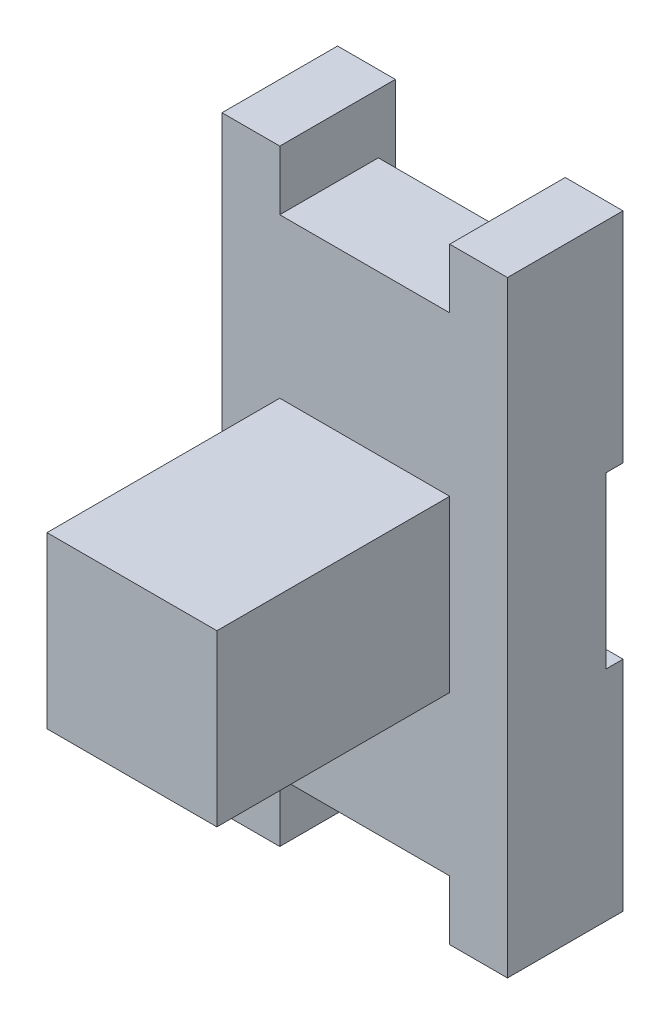
ISO-10303-21;
HEADER;
FILE_DESCRIPTION(('STEP AP214'),'2;1');
FILE_NAME('part.step','',(''),(''),'','','');
FILE_SCHEMA(('AUTOMOTIVE_DESIGN { 1 0 10303 214 1 1 1 1 }'));
ENDSEC;
DATA;
#1=APPLICATION_CONTEXT('core data for automotive mechanical design processes');
#2=APPLICATION_PROTOCOL_DEFINITION('international standard','automotive_design',2000,#1);
#3=PRODUCT_CONTEXT('',#1,'mechanical');
#4=PRODUCT('Part','Part','',(#3));
#5=PRODUCT_RELATED_PRODUCT_CATEGORY('part','',(#4));
#6=PRODUCT_DEFINITION_FORMATION('','',#4);
#7=PRODUCT_DEFINITION_CONTEXT('part definition',#1,'design');
#8=PRODUCT_DEFINITION('design','',#6,#7);
#9=PRODUCT_DEFINITION_SHAPE('','',#8);
#10=(LENGTH_UNIT() NAMED_UNIT(*) SI_UNIT(.MILLI.,.METRE.));
#11=(NAMED_UNIT(*) PLANE_ANGLE_UNIT() SI_UNIT($,.RADIAN.));
#12=(NAMED_UNIT(*) SI_UNIT($,.STERADIAN.) SOLID_ANGLE_UNIT());
#13=UNCERTAINTY_MEASURE_WITH_UNIT(LENGTH_MEASURE(1.E-05),#10,'distance_accuracy_value','');
#14=(GEOMETRIC_REPRESENTATION_CONTEXT(3) GLOBAL_UNCERTAINTY_ASSIGNED_CONTEXT((#13)) GLOBAL_UNIT_ASSIGNED_CONTEXT((#10,
#11,#12)) REPRESENTATION_CONTEXT('',''));
#15=CARTESIAN_POINT('',(0.,0.,0.));
#16=DIRECTION('',(0.,0.,1.));
#17=DIRECTION('',(1.,0.,0.));
#18=AXIS2_PLACEMENT_3D('',#15,#16,#17);
#19=CARTESIAN_POINT('',(0.,0.,-0.68));
#20=DIRECTION('',(0.,0.,1.));
#21=DIRECTION('',(1.,0.,0.));
#22=AXIS2_PLACEMENT_3D('',#19,#20,#21);
#23=PLANE('',#22);
#24=CARTESIAN_POINT('',(0.,0.,-0.68));
#25=DIRECTION('',(0.,0.,1.));
#26=DIRECTION('',(1.,0.,0.));
#27=AXIS2_PLACEMENT_3D('',#24,#25,#26);
#28=CIRCLE('',#27,0.25);
#29=CARTESIAN_POINT('',(0.25,0.,-0.68));
#30=VERTEX_POINT('',#29);
#31=EDGE_CURVE('E20',#30,#30,#28,.T.);
#32=ORIENTED_EDGE('',*,*,#31,.F.);
#33=EDGE_LOOP('',(#32));
#34=FACE_BOUND('',#33,.T.);
#35=ADVANCED_FACE('F17',(#34),#23,.F.);
#36=CARTESIAN_POINT('',(0.,0.,-0.58));
#37=DIRECTION('',(0.,0.,1.));
#38=DIRECTION('',(1.,0.,0.));
#39=AXIS2_PLACEMENT_3D('',#36,#37,#38);
#40=CYLINDRICAL_SURFACE('',#39,0.25);
#41=ORIENTED_EDGE('',*,*,#31,.T.);
#42=EDGE_LOOP('',(#41));
#43=FACE_BOUND('',#42,.T.);
#44=CARTESIAN_POINT('',(0.,0.,-0.58));
#45=DIRECTION('',(0.,0.,1.));
#46=DIRECTION('',(1.,0.,0.));
#47=AXIS2_PLACEMENT_3D('',#44,#45,#46);
#48=CIRCLE('',#47,0.25);
#49=CARTESIAN_POINT('',(0.25,0.,-0.58));
#50=VERTEX_POINT('',#49);
#51=EDGE_CURVE('E213',#50,#50,#48,.T.);
#52=ORIENTED_EDGE('',*,*,#51,.F.);
#53=EDGE_LOOP('',(#52));
#54=FACE_BOUND('',#53,.T.);
#55=ADVANCED_FACE('F223',(#43,#54),#40,.T.);
#56=CARTESIAN_POINT('',(0.,0.,-0.68));
#57=DIRECTION('',(0.,0.,1.));
#58=DIRECTION('',(1.,0.,0.));
#59=AXIS2_PLACEMENT_3D('',#56,#57,#58);
#60=PLANE('',#59);
#61=DIRECTION('',(1.,0.,0.));
#62=VECTOR('',#61,1.);
#63=CARTESIAN_POINT('',(0.5,-0.5,-0.68));
#64=LINE('',#63,#62);
#65=CARTESIAN_POINT('',(0.5,-0.5,-0.68));
#66=VERTEX_POINT('',#65);
#67=CARTESIAN_POINT('',(0.84,-0.5,-0.68));
#68=VERTEX_POINT('',#67);
#69=EDGE_CURVE('E176',#66,#68,#64,.T.);
#70=ORIENTED_EDGE('',*,*,#69,.T.);
#71=DIRECTION('',(0.,1.,0.));
#72=VECTOR('',#71,1.);
#73=CARTESIAN_POINT('',(0.84,-1.785,-0.68));
#74=LINE('',#73,#72);
#75=CARTESIAN_POINT('',(0.84,-1.785,-0.68));
#76=VERTEX_POINT('',#75);
#77=EDGE_CURVE('E541',#76,#68,#74,.T.);
#78=ORIENTED_EDGE('',*,*,#77,.F.);
#79=DIRECTION('',(1.,0.,0.));
#80=VECTOR('',#79,1.);
#81=CARTESIAN_POINT('',(0.5,-1.785,-0.68));
#82=LINE('',#81,#80);
#83=CARTESIAN_POINT('',(0.5,-1.785,-0.68));
#84=VERTEX_POINT('',#83);
#85=EDGE_CURVE('E552',#84,#76,#82,.T.);
#86=ORIENTED_EDGE('',*,*,#85,.F.);
#87=DIRECTION('',(0.,1.,0.));
#88=VECTOR('',#87,1.);
#89=CARTESIAN_POINT('',(0.5,-1.435,-0.68));
#90=LINE('',#89,#88);
#91=EDGE_CURVE('E198',#66,#84,#90,.F.);
#92=ORIENTED_EDGE('',*,*,#91,.F.);
#93=EDGE_LOOP('',(#70,#78,#86,#92));
#94=FACE_BOUND('',#93,.T.);
#95=ADVANCED_FACE('F225',(#94),#60,.F.);
#96=CARTESIAN_POINT('',(0.5,-0.5,-0.58));
#97=DIRECTION('',(0.,-1.,0.));
#98=DIRECTION('',(0.,0.,-1.));
#99=AXIS2_PLACEMENT_3D('',#96,#97,#98);
#100=PLANE('',#99);
#101=DIRECTION('',(0.,0.,1.));
#102=VECTOR('',#101,1.);
#103=CARTESIAN_POINT('',(0.5,-0.5,-0.68));
#104=LINE('',#103,#102);
#105=CARTESIAN_POINT('',(0.5,-0.5,-0.58));
#106=VERTEX_POINT('',#105);
#107=EDGE_CURVE('E195',#106,#66,#104,.F.);
#108=ORIENTED_EDGE('',*,*,#107,.F.);
#109=DIRECTION('',(-1.,0.,0.));
#110=VECTOR('',#109,1.);
#111=CARTESIAN_POINT('',(0.,-0.5,-0.58));
#112=LINE('',#111,#110);
#113=CARTESIAN_POINT('',(0.84,-0.5,-0.58));
#114=VERTEX_POINT('',#113);
#115=EDGE_CURVE('E181',#114,#106,#112,.T.);
#116=ORIENTED_EDGE('',*,*,#115,.F.);
#117=DIRECTION('',(0.,0.,-1.));
#118=VECTOR('',#117,1.);
#119=CARTESIAN_POINT('',(0.84,-0.5,-0.68));
#120=LINE('',#119,#118);
#121=EDGE_CURVE('E539',#68,#114,#120,.F.);
#122=ORIENTED_EDGE('',*,*,#121,.F.);
#123=ORIENTED_EDGE('',*,*,#69,.F.);
#124=EDGE_LOOP('',(#108,#116,#122,#123));
#125=FACE_BOUND('',#124,.T.);
#126=ADVANCED_FACE('F196',(#125),#100,.F.);
#127=CARTESIAN_POINT('',(0.,0.,-0.68));
#128=DIRECTION('',(0.,0.,1.));
#129=DIRECTION('',(1.,0.,0.));
#130=AXIS2_PLACEMENT_3D('',#127,#128,#129);
#131=PLANE('',#130);
#132=DIRECTION('',(0.,1.,0.));
#133=VECTOR('',#132,1.);
#134=CARTESIAN_POINT('',(0.5,1.435,-0.68));
#135=LINE('',#134,#133);
#136=CARTESIAN_POINT('',(0.5,1.785,-0.68));
#137=VERTEX_POINT('',#136);
#138=CARTESIAN_POINT('',(0.5,0.5,-0.68));
#139=VERTEX_POINT('',#138);
#140=EDGE_CURVE('E517',#137,#139,#135,.F.);
#141=ORIENTED_EDGE('',*,*,#140,.F.);
#142=DIRECTION('',(1.,0.,0.));
#143=VECTOR('',#142,1.);
#144=CARTESIAN_POINT('',(0.84,1.785,-0.68));
#145=LINE('',#144,#143);
#146=CARTESIAN_POINT('',(0.84,1.785,-0.68));
#147=VERTEX_POINT('',#146);
#148=EDGE_CURVE('E520',#147,#137,#145,.F.);
#149=ORIENTED_EDGE('',*,*,#148,.F.);
#150=DIRECTION('',(0.,1.,0.));
#151=VECTOR('',#150,1.);
#152=CARTESIAN_POINT('',(0.84,-1.785,-0.68));
#153=LINE('',#152,#151);
#154=CARTESIAN_POINT('',(0.84,0.5,-0.68));
#155=VERTEX_POINT('',#154);
#156=EDGE_CURVE('E547',#155,#147,#153,.T.);
#157=ORIENTED_EDGE('',*,*,#156,.F.);
#158=DIRECTION('',(1.,0.,0.));
#159=VECTOR('',#158,1.);
#160=CARTESIAN_POINT('',(0.5,0.5,-0.68));
#161=LINE('',#160,#159);
#162=EDGE_CURVE('E218',#155,#139,#161,.F.);
#163=ORIENTED_EDGE('',*,*,#162,.T.);
#164=EDGE_LOOP('',(#141,#149,#157,#163));
#165=FACE_BOUND('',#164,.T.);
#166=ADVANCED_FACE('F331',(#165),#131,.F.);
#167=CARTESIAN_POINT('',(0.5,0.5,-0.58));
#168=DIRECTION('',(0.,1.,0.));
#169=DIRECTION('',(0.,0.,1.));
#170=AXIS2_PLACEMENT_3D('',#167,#168,#169);
#171=PLANE('',#170);
#172=DIRECTION('',(0.,0.,-1.));
#173=VECTOR('',#172,1.);
#174=CARTESIAN_POINT('',(0.84,0.5,-0.68));
#175=LINE('',#174,#173);
#176=CARTESIAN_POINT('',(0.84,0.5,-0.58));
#177=VERTEX_POINT('',#176);
#178=EDGE_CURVE('E549',#177,#155,#175,.T.);
#179=ORIENTED_EDGE('',*,*,#178,.F.);
#180=DIRECTION('',(-1.,0.,0.));
#181=VECTOR('',#180,1.);
#182=CARTESIAN_POINT('',(0.,0.5,-0.58));
#183=LINE('',#182,#181);
#184=CARTESIAN_POINT('',(0.5,0.5,-0.58));
#185=VERTEX_POINT('',#184);
#186=EDGE_CURVE('E192',#185,#177,#183,.F.);
#187=ORIENTED_EDGE('',*,*,#186,.F.);
#188=DIRECTION('',(0.,0.,1.));
#189=VECTOR('',#188,1.);
#190=CARTESIAN_POINT('',(0.5,0.5,-0.68));
#191=LINE('',#190,#189);
#192=EDGE_CURVE('E524',#139,#185,#191,.T.);
#193=ORIENTED_EDGE('',*,*,#192,.F.);
#194=ORIENTED_EDGE('',*,*,#162,.F.);
#195=EDGE_LOOP('',(#179,#187,#193,#194));
#196=FACE_BOUND('',#195,.T.);
#197=ADVANCED_FACE('F327',(#196),#171,.F.);
#198=CARTESIAN_POINT('',(0.,0.,-0.68));
#199=DIRECTION('',(0.,0.,1.));
#200=DIRECTION('',(1.,0.,0.));
#201=AXIS2_PLACEMENT_3D('',#198,#199,#200);
#202=PLANE('',#201);
#203=DIRECTION('',(-1.,0.,0.));
#204=VECTOR('',#203,1.);
#205=CARTESIAN_POINT('',(-0.84,0.5,-0.68));
#206=LINE('',#205,#204);
#207=CARTESIAN_POINT('',(-0.5,0.5,-0.68));
#208=VERTEX_POINT('',#207);
#209=CARTESIAN_POINT('',(-0.84,0.5,-0.68));
#210=VERTEX_POINT('',#209);
#211=EDGE_CURVE('E216',#208,#210,#206,.T.);
#212=ORIENTED_EDGE('',*,*,#211,.T.);
#213=DIRECTION('',(0.,1.,0.));
#214=VECTOR('',#213,1.);
#215=CARTESIAN_POINT('',(-0.84,1.785,-0.68));
#216=LINE('',#215,#214);
#217=CARTESIAN_POINT('',(-0.84,1.785,-0.68));
#218=VERTEX_POINT('',#217);
#219=EDGE_CURVE('E618',#218,#210,#216,.F.);
#220=ORIENTED_EDGE('',*,*,#219,.F.);
#221=DIRECTION('',(1.,0.,0.));
#222=VECTOR('',#221,1.);
#223=CARTESIAN_POINT('',(-0.5,1.785,-0.68));
#224=LINE('',#223,#222);
#225=CARTESIAN_POINT('',(-0.5,1.785,-0.68));
#226=VERTEX_POINT('',#225);
#227=EDGE_CURVE('E629',#226,#218,#224,.F.);
#228=ORIENTED_EDGE('',*,*,#227,.F.);
#229=DIRECTION('',(0.,1.,0.));
#230=VECTOR('',#229,1.);
#231=CARTESIAN_POINT('',(-0.5,1.785,-0.68));
#232=LINE('',#231,#230);
#233=EDGE_CURVE('E634',#208,#226,#232,.T.);
#234=ORIENTED_EDGE('',*,*,#233,.F.);
#235=EDGE_LOOP('',(#212,#220,#228,#234));
#236=FACE_BOUND('',#235,.T.);
#237=ADVANCED_FACE('F323',(#236),#202,.F.);
#238=CARTESIAN_POINT('',(-0.84,0.5,-0.58));
#239=DIRECTION('',(0.,1.,0.));
#240=DIRECTION('',(-1.,0.,0.));
#241=AXIS2_PLACEMENT_3D('',#238,#239,#240);
#242=PLANE('',#241);
#243=DIRECTION('',(0.,0.,-1.));
#244=VECTOR('',#243,1.);
#245=CARTESIAN_POINT('',(-0.5,0.5,-0.68));
#246=LINE('',#245,#244);
#247=CARTESIAN_POINT('',(-0.5,0.5,-0.58));
#248=VERTEX_POINT('',#247);
#249=EDGE_CURVE('E636',#248,#208,#246,.T.);
#250=ORIENTED_EDGE('',*,*,#249,.F.);
#251=DIRECTION('',(-1.,0.,0.));
#252=VECTOR('',#251,1.);
#253=CARTESIAN_POINT('',(0.,0.5,-0.58));
#254=LINE('',#253,#252);
#255=CARTESIAN_POINT('',(-0.84,0.5,-0.58));
#256=VERTEX_POINT('',#255);
#257=EDGE_CURVE('E208',#256,#248,#254,.F.);
#258=ORIENTED_EDGE('',*,*,#257,.F.);
#259=DIRECTION('',(0.,0.,1.));
#260=VECTOR('',#259,1.);
#261=CARTESIAN_POINT('',(-0.84,0.5,-0.68));
#262=LINE('',#261,#260);
#263=EDGE_CURVE('E615',#210,#256,#262,.T.);
#264=ORIENTED_EDGE('',*,*,#263,.F.);
#265=ORIENTED_EDGE('',*,*,#211,.F.);
#266=EDGE_LOOP('',(#250,#258,#264,#265));
#267=FACE_BOUND('',#266,.T.);
#268=ADVANCED_FACE('F319',(#267),#242,.F.);
#269=CARTESIAN_POINT('',(0.,0.,-0.68));
#270=DIRECTION('',(0.,0.,1.));
#271=DIRECTION('',(1.,0.,0.));
#272=AXIS2_PLACEMENT_3D('',#269,#270,#271);
#273=PLANE('',#272);
#274=DIRECTION('',(0.,1.,0.));
#275=VECTOR('',#274,1.);
#276=CARTESIAN_POINT('',(-0.5,-1.785,-0.68));
#277=LINE('',#276,#275);
#278=CARTESIAN_POINT('',(-0.5,-1.785,-0.68));
#279=VERTEX_POINT('',#278);
#280=CARTESIAN_POINT('',(-0.5,-0.5,-0.68));
#281=VERTEX_POINT('',#280);
#282=EDGE_CURVE('E601',#279,#281,#277,.T.);
#283=ORIENTED_EDGE('',*,*,#282,.F.);
#284=DIRECTION('',(1.,0.,0.));
#285=VECTOR('',#284,1.);
#286=CARTESIAN_POINT('',(-0.84,-1.785,-0.68));
#287=LINE('',#286,#285);
#288=CARTESIAN_POINT('',(-0.84,-1.785,-0.68));
#289=VERTEX_POINT('',#288);
#290=EDGE_CURVE('E607',#289,#279,#287,.T.);
#291=ORIENTED_EDGE('',*,*,#290,.F.);
#292=DIRECTION('',(0.,1.,0.));
#293=VECTOR('',#292,1.);
#294=CARTESIAN_POINT('',(-0.84,1.785,-0.68));
#295=LINE('',#294,#293);
#296=CARTESIAN_POINT('',(-0.84,-0.5,-0.68));
#297=VERTEX_POINT('',#296);
#298=EDGE_CURVE('E624',#297,#289,#295,.F.);
#299=ORIENTED_EDGE('',*,*,#298,.F.);
#300=DIRECTION('',(1.,0.,0.));
#301=VECTOR('',#300,1.);
#302=CARTESIAN_POINT('',(-0.5,-0.5,-0.68));
#303=LINE('',#302,#301);
#304=EDGE_CURVE('E214',#297,#281,#303,.T.);
#305=ORIENTED_EDGE('',*,*,#304,.T.);
#306=EDGE_LOOP('',(#283,#291,#299,#305));
#307=FACE_BOUND('',#306,.T.);
#308=ADVANCED_FACE('F315',(#307),#273,.F.);
#309=CARTESIAN_POINT('',(-0.5,-0.5,-0.58));
#310=DIRECTION('',(0.,-1.,0.));
#311=DIRECTION('',(0.,0.,-1.));
#312=AXIS2_PLACEMENT_3D('',#309,#310,#311);
#313=PLANE('',#312);
#314=DIRECTION('',(0.,0.,1.));
#315=VECTOR('',#314,1.);
#316=CARTESIAN_POINT('',(-0.84,-0.5,-0.68));
#317=LINE('',#316,#315);
#318=CARTESIAN_POINT('',(-0.84,-0.5,-0.58));
#319=VERTEX_POINT('',#318);
#320=EDGE_CURVE('E626',#319,#297,#317,.F.);
#321=ORIENTED_EDGE('',*,*,#320,.F.);
#322=DIRECTION('',(-1.,0.,0.));
#323=VECTOR('',#322,1.);
#324=CARTESIAN_POINT('',(0.,-0.5,-0.58));
#325=LINE('',#324,#323);
#326=CARTESIAN_POINT('',(-0.5,-0.5,-0.58));
#327=VERTEX_POINT('',#326);
#328=EDGE_CURVE('E210',#327,#319,#325,.T.);
#329=ORIENTED_EDGE('',*,*,#328,.F.);
#330=DIRECTION('',(0.,0.,-1.));
#331=VECTOR('',#330,1.);
#332=CARTESIAN_POINT('',(-0.5,-0.5,-0.68));
#333=LINE('',#332,#331);
#334=EDGE_CURVE('E598',#281,#327,#333,.F.);
#335=ORIENTED_EDGE('',*,*,#334,.F.);
#336=ORIENTED_EDGE('',*,*,#304,.F.);
#337=EDGE_LOOP('',(#321,#329,#335,#336));
#338=FACE_BOUND('',#337,.T.);
#339=ADVANCED_FACE('F312',(#338),#313,.F.);
#340=CARTESIAN_POINT('',(0.,0.,-0.58));
#341=DIRECTION('',(0.,0.,-1.));
#342=DIRECTION('',(-1.,0.,0.));
#343=AXIS2_PLACEMENT_3D('',#340,#341,#342);
#344=PLANE('',#343);
#345=ORIENTED_EDGE('',*,*,#115,.T.);
#346=DIRECTION('',(0.,1.,0.));
#347=VECTOR('',#346,1.);
#348=CARTESIAN_POINT('',(0.5,-1.435,-0.58));
#349=LINE('',#348,#347);
#350=CARTESIAN_POINT('',(0.5,-1.435,-0.58));
#351=VERTEX_POINT('',#350);
#352=EDGE_CURVE('E186',#351,#106,#349,.T.);
#353=ORIENTED_EDGE('',*,*,#352,.F.);
#354=DIRECTION('',(1.,0.,0.));
#355=VECTOR('',#354,1.);
#356=CARTESIAN_POINT('',(-0.5,-1.435,-0.58));
#357=LINE('',#356,#355);
#358=CARTESIAN_POINT('',(-0.5,-1.435,-0.58));
#359=VERTEX_POINT('',#358);
#360=EDGE_CURVE('E591',#359,#351,#357,.T.);
#361=ORIENTED_EDGE('',*,*,#360,.F.);
#362=DIRECTION('',(0.,1.,0.));
#363=VECTOR('',#362,1.);
#364=CARTESIAN_POINT('',(-0.5,-1.785,-0.58));
#365=LINE('',#364,#363);
#366=EDGE_CURVE('E596',#327,#359,#365,.F.);
#367=ORIENTED_EDGE('',*,*,#366,.F.);
#368=ORIENTED_EDGE('',*,*,#328,.T.);
#369=DIRECTION('',(0.,1.,0.));
#370=VECTOR('',#369,1.);
#371=CARTESIAN_POINT('',(-0.84,1.785,-0.58));
#372=LINE('',#371,#370);
#373=EDGE_CURVE('E612',#256,#319,#372,.F.);
#374=ORIENTED_EDGE('',*,*,#373,.F.);
#375=ORIENTED_EDGE('',*,*,#257,.T.);
#376=DIRECTION('',(0.,1.,0.));
#377=VECTOR('',#376,1.);
#378=CARTESIAN_POINT('',(-0.5,1.785,-0.58));
#379=LINE('',#378,#377);
#380=CARTESIAN_POINT('',(-0.5,1.435,-0.58));
#381=VERTEX_POINT('',#380);
#382=EDGE_CURVE('E639',#381,#248,#379,.F.);
#383=ORIENTED_EDGE('',*,*,#382,.F.);
#384=DIRECTION('',(-1.,0.,0.));
#385=VECTOR('',#384,1.);
#386=CARTESIAN_POINT('',(-0.5,1.435,-0.58));
#387=LINE('',#386,#385);
#388=CARTESIAN_POINT('',(0.5,1.435,-0.58));
#389=VERTEX_POINT('',#388);
#390=EDGE_CURVE('E645',#389,#381,#387,.T.);
#391=ORIENTED_EDGE('',*,*,#390,.F.);
#392=DIRECTION('',(0.,1.,0.));
#393=VECTOR('',#392,1.);
#394=CARTESIAN_POINT('',(0.5,1.435,-0.58));
#395=LINE('',#394,#393);
#396=EDGE_CURVE('E650',#185,#389,#395,.T.);
#397=ORIENTED_EDGE('',*,*,#396,.F.);
#398=ORIENTED_EDGE('',*,*,#186,.T.);
#399=DIRECTION('',(0.,1.,0.));
#400=VECTOR('',#399,1.);
#401=CARTESIAN_POINT('',(0.84,-1.785,-0.58));
#402=LINE('',#401,#400);
#403=EDGE_CURVE('E190',#114,#177,#402,.T.);
#404=ORIENTED_EDGE('',*,*,#403,.F.);
#405=EDGE_LOOP('',(#345,#353,#361,#367,#368,#374,#375,#383,#391,#397,#398,#404));
#406=FACE_BOUND('',#405,.T.);
#407=ORIENTED_EDGE('',*,*,#51,.T.);
#408=EDGE_LOOP('',(#407));
#409=FACE_BOUND('',#408,.T.);
#410=ADVANCED_FACE('F182',(#406,#409),#344,.T.);
#411=CARTESIAN_POINT('',(0.,0.,1.37));
#412=DIRECTION('',(0.,0.,1.));
#413=DIRECTION('',(1.,0.,0.));
#414=AXIS2_PLACEMENT_3D('',#411,#412,#413);
#415=PLANE('',#414);
#416=DIRECTION('',(0.,1.,0.));
#417=VECTOR('',#416,1.);
#418=CARTESIAN_POINT('',(0.5,-0.5,1.37));
#419=LINE('',#418,#417);
#420=CARTESIAN_POINT('',(0.5,-0.5,1.37));
#421=VERTEX_POINT('',#420);
#422=CARTESIAN_POINT('',(0.5,0.5,1.37));
#423=VERTEX_POINT('',#422);
#424=EDGE_CURVE('E572',#421,#423,#419,.T.);
#425=ORIENTED_EDGE('',*,*,#424,.T.);
#426=DIRECTION('',(1.,0.,0.));
#427=VECTOR('',#426,1.);
#428=CARTESIAN_POINT('',(0.5,0.5,1.37));
#429=LINE('',#428,#427);
#430=CARTESIAN_POINT('',(-0.5,0.5,1.37));
#431=VERTEX_POINT('',#430);
#432=EDGE_CURVE('E582',#423,#431,#429,.F.);
#433=ORIENTED_EDGE('',*,*,#432,.T.);
#434=DIRECTION('',(0.,1.,0.));
#435=VECTOR('',#434,1.);
#436=CARTESIAN_POINT('',(-0.5,0.5,1.37));
#437=LINE('',#436,#435);
#438=CARTESIAN_POINT('',(-0.5,-0.5,1.37));
#439=VERTEX_POINT('',#438);
#440=EDGE_CURVE('E586',#431,#439,#437,.F.);
#441=ORIENTED_EDGE('',*,*,#440,.T.);
#442=DIRECTION('',(1.,0.,0.));
#443=VECTOR('',#442,1.);
#444=CARTESIAN_POINT('',(-0.5,-0.5,1.37));
#445=LINE('',#444,#443);
#446=EDGE_CURVE('E588',#439,#421,#445,.T.);
#447=ORIENTED_EDGE('',*,*,#446,.T.);
#448=EDGE_LOOP('',(#425,#433,#441,#447));
#449=FACE_BOUND('',#448,.T.);
#450=ADVANCED_FACE('F306',(#449),#415,.T.);
#451=CARTESIAN_POINT('',(0.5,-1.435,-0.68));
#452=DIRECTION('',(-1.,0.,0.));
#453=DIRECTION('',(0.,0.,1.));
#454=AXIS2_PLACEMENT_3D('',#451,#452,#453);
#455=PLANE('',#454);
#456=ORIENTED_EDGE('',*,*,#91,.T.);
#457=DIRECTION('',(0.,0.,-1.));
#458=VECTOR('',#457,1.);
#459=CARTESIAN_POINT('',(0.5,-1.785,-0.68));
#460=LINE('',#459,#458);
#461=CARTESIAN_POINT('',(0.5,-1.785,0.));
#462=VERTEX_POINT('',#461);
#463=EDGE_CURVE('E554',#462,#84,#460,.T.);
#464=ORIENTED_EDGE('',*,*,#463,.F.);
#465=DIRECTION('',(0.,1.,0.));
#466=VECTOR('',#465,1.);
#467=CARTESIAN_POINT('',(0.5,0.,0.));
#468=LINE('',#467,#466);
#469=CARTESIAN_POINT('',(0.5,-1.435,0.));
#470=VERTEX_POINT('',#469);
#471=EDGE_CURVE('E565',#470,#462,#468,.F.);
#472=ORIENTED_EDGE('',*,*,#471,.F.);
#473=DIRECTION('',(0.,0.,-1.));
#474=VECTOR('',#473,1.);
#475=CARTESIAN_POINT('',(0.5,-1.435,-0.68));
#476=LINE('',#475,#474);
#477=EDGE_CURVE('E202',#351,#470,#476,.F.);
#478=ORIENTED_EDGE('',*,*,#477,.F.);
#479=ORIENTED_EDGE('',*,*,#352,.T.);
#480=ORIENTED_EDGE('',*,*,#107,.T.);
#481=EDGE_LOOP('',(#456,#464,#472,#478,#479,#480));
#482=FACE_BOUND('',#481,.T.);
#483=ADVANCED_FACE('F200',(#482),#455,.T.);
#484=CARTESIAN_POINT('',(0.5,-1.785,-0.68));
#485=DIRECTION('',(0.,-1.,0.));
#486=DIRECTION('',(0.,0.,-1.));
#487=AXIS2_PLACEMENT_3D('',#484,#485,#486);
#488=PLANE('',#487);
#489=ORIENTED_EDGE('',*,*,#85,.T.);
#490=DIRECTION('',(0.,0.,-1.));
#491=VECTOR('',#490,1.);
#492=CARTESIAN_POINT('',(0.84,-1.785,-0.68));
#493=LINE('',#492,#491);
#494=CARTESIAN_POINT('',(0.84,-1.785,0.));
#495=VERTEX_POINT('',#494);
#496=EDGE_CURVE('E544',#495,#76,#493,.T.);
#497=ORIENTED_EDGE('',*,*,#496,.F.);
#498=DIRECTION('',(1.,0.,0.));
#499=VECTOR('',#498,1.);
#500=CARTESIAN_POINT('',(0.,-1.785,0.));
#501=LINE('',#500,#499);
#502=EDGE_CURVE('E560',#462,#495,#501,.T.);
#503=ORIENTED_EDGE('',*,*,#502,.F.);
#504=ORIENTED_EDGE('',*,*,#463,.T.);
#505=EDGE_LOOP('',(#489,#497,#503,#504));
#506=FACE_BOUND('',#505,.T.);
#507=ADVANCED_FACE('F299',(#506),#488,.T.);
#508=CARTESIAN_POINT('',(0.84,-1.785,-0.68));
#509=DIRECTION('',(1.,0.,0.));
#510=DIRECTION('',(0.,0.,-1.));
#511=AXIS2_PLACEMENT_3D('',#508,#509,#510);
#512=PLANE('',#511);
#513=ORIENTED_EDGE('',*,*,#121,.T.);
#514=ORIENTED_EDGE('',*,*,#403,.T.);
#515=ORIENTED_EDGE('',*,*,#178,.T.);
#516=ORIENTED_EDGE('',*,*,#156,.T.);
#517=DIRECTION('',(0.,0.,1.));
#518=VECTOR('',#517,1.);
#519=CARTESIAN_POINT('',(0.84,1.785,-0.68));
#520=LINE('',#519,#518);
#521=CARTESIAN_POINT('',(0.84,1.785,0.));
#522=VERTEX_POINT('',#521);
#523=EDGE_CURVE('E533',#522,#147,#520,.F.);
#524=ORIENTED_EDGE('',*,*,#523,.F.);
#525=DIRECTION('',(0.,1.,0.));
#526=VECTOR('',#525,1.);
#527=CARTESIAN_POINT('',(0.84,0.,0.));
#528=LINE('',#527,#526);
#529=EDGE_CURVE('E564',#495,#522,#528,.T.);
#530=ORIENTED_EDGE('',*,*,#529,.F.);
#531=ORIENTED_EDGE('',*,*,#496,.T.);
#532=ORIENTED_EDGE('',*,*,#77,.T.);
#533=EDGE_LOOP('',(#513,#514,#515,#516,#524,#530,#531,#532));
#534=FACE_BOUND('',#533,.T.);
#535=ADVANCED_FACE('F295',(#534),#512,.T.);
#536=CARTESIAN_POINT('',(0.84,1.785,-0.68));
#537=DIRECTION('',(0.,1.,0.));
#538=DIRECTION('',(0.,0.,1.));
#539=AXIS2_PLACEMENT_3D('',#536,#537,#538);
#540=PLANE('',#539);
#541=ORIENTED_EDGE('',*,*,#148,.T.);
#542=DIRECTION('',(0.,0.,1.));
#543=VECTOR('',#542,1.);
#544=CARTESIAN_POINT('',(0.5,1.785,-0.68));
#545=LINE('',#544,#543);
#546=CARTESIAN_POINT('',(0.5,1.785,0.));
#547=VERTEX_POINT('',#546);
#548=EDGE_CURVE('E525',#547,#137,#545,.F.);
#549=ORIENTED_EDGE('',*,*,#548,.F.);
#550=DIRECTION('',(1.,0.,0.));
#551=VECTOR('',#550,1.);
#552=CARTESIAN_POINT('',(0.,1.785,0.));
#553=LINE('',#552,#551);
#554=EDGE_CURVE('E661',#522,#547,#553,.F.);
#555=ORIENTED_EDGE('',*,*,#554,.F.);
#556=ORIENTED_EDGE('',*,*,#523,.T.);
#557=EDGE_LOOP('',(#541,#549,#555,#556));
#558=FACE_BOUND('',#557,.T.);
#559=ADVANCED_FACE('F291',(#558),#540,.T.);
#560=CARTESIAN_POINT('',(0.5,1.435,-0.68));
#561=DIRECTION('',(-1.,0.,0.));
#562=DIRECTION('',(0.,0.,1.));
#563=AXIS2_PLACEMENT_3D('',#560,#561,#562);
#564=PLANE('',#563);
#565=ORIENTED_EDGE('',*,*,#396,.T.);
#566=DIRECTION('',(0.,0.,1.));
#567=VECTOR('',#566,1.);
#568=CARTESIAN_POINT('',(0.5,1.435,-0.68));
#569=LINE('',#568,#567);
#570=CARTESIAN_POINT('',(0.5,1.435,0.));
#571=VERTEX_POINT('',#570);
#572=EDGE_CURVE('E647',#571,#389,#569,.F.);
#573=ORIENTED_EDGE('',*,*,#572,.F.);
#574=DIRECTION('',(0.,1.,0.));
#575=VECTOR('',#574,1.);
#576=CARTESIAN_POINT('',(0.5,0.,0.));
#577=LINE('',#576,#575);
#578=EDGE_CURVE('E529',#547,#571,#577,.F.);
#579=ORIENTED_EDGE('',*,*,#578,.F.);
#580=ORIENTED_EDGE('',*,*,#548,.T.);
#581=ORIENTED_EDGE('',*,*,#140,.T.);
#582=ORIENTED_EDGE('',*,*,#192,.T.);
#583=EDGE_LOOP('',(#565,#573,#579,#580,#581,#582));
#584=FACE_BOUND('',#583,.T.);
#585=ADVANCED_FACE('F287',(#584),#564,.T.);
#586=CARTESIAN_POINT('',(-0.5,1.435,-0.68));
#587=DIRECTION('',(0.,1.,0.));
#588=DIRECTION('',(-1.,0.,0.));
#589=AXIS2_PLACEMENT_3D('',#586,#587,#588);
#590=PLANE('',#589);
#591=DIRECTION('',(0.,0.,-1.));
#592=VECTOR('',#591,1.);
#593=CARTESIAN_POINT('',(-0.5,1.435,-0.68));
#594=LINE('',#593,#592);
#595=CARTESIAN_POINT('',(-0.5,1.435,0.));
#596=VERTEX_POINT('',#595);
#597=EDGE_CURVE('E642',#596,#381,#594,.T.);
#598=ORIENTED_EDGE('',*,*,#597,.F.);
#599=DIRECTION('',(1.,0.,0.));
#600=VECTOR('',#599,1.);
#601=CARTESIAN_POINT('',(0.,1.435,0.));
#602=LINE('',#601,#600);
#603=EDGE_CURVE('E656',#571,#596,#602,.F.);
#604=ORIENTED_EDGE('',*,*,#603,.F.);
#605=ORIENTED_EDGE('',*,*,#572,.T.);
#606=ORIENTED_EDGE('',*,*,#390,.T.);
#607=EDGE_LOOP('',(#598,#604,#605,#606));
#608=FACE_BOUND('',#607,.T.);
#609=ADVANCED_FACE('F283',(#608),#590,.T.);
#610=CARTESIAN_POINT('',(-0.5,1.785,-0.68));
#611=DIRECTION('',(1.,0.,0.));
#612=DIRECTION('',(0.,0.,-1.));
#613=AXIS2_PLACEMENT_3D('',#610,#611,#612);
#614=PLANE('',#613);
#615=ORIENTED_EDGE('',*,*,#233,.T.);
#616=DIRECTION('',(0.,0.,1.));
#617=VECTOR('',#616,1.);
#618=CARTESIAN_POINT('',(-0.5,1.785,-0.68));
#619=LINE('',#618,#617);
#620=CARTESIAN_POINT('',(-0.5,1.785,0.));
#621=VERTEX_POINT('',#620);
#622=EDGE_CURVE('E631',#621,#226,#619,.F.);
#623=ORIENTED_EDGE('',*,*,#622,.F.);
#624=DIRECTION('',(0.,1.,0.));
#625=VECTOR('',#624,1.);
#626=CARTESIAN_POINT('',(-0.5,0.,0.));
#627=LINE('',#626,#625);
#628=EDGE_CURVE('E659',#596,#621,#627,.T.);
#629=ORIENTED_EDGE('',*,*,#628,.F.);
#630=ORIENTED_EDGE('',*,*,#597,.T.);
#631=ORIENTED_EDGE('',*,*,#382,.T.);
#632=ORIENTED_EDGE('',*,*,#249,.T.);
#633=EDGE_LOOP('',(#615,#623,#629,#630,#631,#632));
#634=FACE_BOUND('',#633,.T.);
#635=ADVANCED_FACE('F279',(#634),#614,.T.);
#636=CARTESIAN_POINT('',(-0.5,1.785,-0.68));
#637=DIRECTION('',(0.,1.,0.));
#638=DIRECTION('',(0.,0.,1.));
#639=AXIS2_PLACEMENT_3D('',#636,#637,#638);
#640=PLANE('',#639);
#641=ORIENTED_EDGE('',*,*,#227,.T.);
#642=DIRECTION('',(0.,0.,1.));
#643=VECTOR('',#642,1.);
#644=CARTESIAN_POINT('',(-0.84,1.785,-0.68));
#645=LINE('',#644,#643);
#646=CARTESIAN_POINT('',(-0.84,1.785,0.));
#647=VERTEX_POINT('',#646);
#648=EDGE_CURVE('E621',#647,#218,#645,.F.);
#649=ORIENTED_EDGE('',*,*,#648,.F.);
#650=DIRECTION('',(1.,0.,0.));
#651=VECTOR('',#650,1.);
#652=CARTESIAN_POINT('',(0.,1.785,0.));
#653=LINE('',#652,#651);
#654=EDGE_CURVE('E666',#621,#647,#653,.F.);
#655=ORIENTED_EDGE('',*,*,#654,.F.);
#656=ORIENTED_EDGE('',*,*,#622,.T.);
#657=EDGE_LOOP('',(#641,#649,#655,#656));
#658=FACE_BOUND('',#657,.T.);
#659=ADVANCED_FACE('F275',(#658),#640,.T.);
#660=CARTESIAN_POINT('',(-0.84,1.785,-0.68));
#661=DIRECTION('',(-1.,0.,0.));
#662=DIRECTION('',(0.,0.,1.));
#663=AXIS2_PLACEMENT_3D('',#660,#661,#662);
#664=PLANE('',#663);
#665=ORIENTED_EDGE('',*,*,#263,.T.);
#666=ORIENTED_EDGE('',*,*,#373,.T.);
#667=ORIENTED_EDGE('',*,*,#320,.T.);
#668=ORIENTED_EDGE('',*,*,#298,.T.);
#669=DIRECTION('',(0.,0.,-1.));
#670=VECTOR('',#669,1.);
#671=CARTESIAN_POINT('',(-0.84,-1.785,-0.68));
#672=LINE('',#671,#670);
#673=CARTESIAN_POINT('',(-0.84,-1.785,0.));
#674=VERTEX_POINT('',#673);
#675=EDGE_CURVE('E609',#674,#289,#672,.T.);
#676=ORIENTED_EDGE('',*,*,#675,.F.);
#677=DIRECTION('',(0.,1.,0.));
#678=VECTOR('',#677,1.);
#679=CARTESIAN_POINT('',(-0.84,0.,0.));
#680=LINE('',#679,#678);
#681=EDGE_CURVE('E669',#647,#674,#680,.F.);
#682=ORIENTED_EDGE('',*,*,#681,.F.);
#683=ORIENTED_EDGE('',*,*,#648,.T.);
#684=ORIENTED_EDGE('',*,*,#219,.T.);
#685=EDGE_LOOP('',(#665,#666,#667,#668,#676,#682,#683,#684));
#686=FACE_BOUND('',#685,.T.);
#687=ADVANCED_FACE('F271',(#686),#664,.T.);
#688=CARTESIAN_POINT('',(-0.84,-1.785,-0.68));
#689=DIRECTION('',(0.,-1.,0.));
#690=DIRECTION('',(0.,0.,-1.));
#691=AXIS2_PLACEMENT_3D('',#688,#689,#690);
#692=PLANE('',#691);
#693=ORIENTED_EDGE('',*,*,#290,.T.);
#694=DIRECTION('',(0.,0.,-1.));
#695=VECTOR('',#694,1.);
#696=CARTESIAN_POINT('',(-0.5,-1.785,-0.68));
#697=LINE('',#696,#695);
#698=CARTESIAN_POINT('',(-0.5,-1.785,0.));
#699=VERTEX_POINT('',#698);
#700=EDGE_CURVE('E604',#699,#279,#697,.T.);
#701=ORIENTED_EDGE('',*,*,#700,.F.);
#702=DIRECTION('',(1.,0.,0.));
#703=VECTOR('',#702,1.);
#704=CARTESIAN_POINT('',(0.,-1.785,0.));
#705=LINE('',#704,#703);
#706=EDGE_CURVE('E672',#674,#699,#705,.T.);
#707=ORIENTED_EDGE('',*,*,#706,.F.);
#708=ORIENTED_EDGE('',*,*,#675,.T.);
#709=EDGE_LOOP('',(#693,#701,#707,#708));
#710=FACE_BOUND('',#709,.T.);
#711=ADVANCED_FACE('F267',(#710),#692,.T.);
#712=CARTESIAN_POINT('',(-0.5,-1.785,-0.68));
#713=DIRECTION('',(1.,0.,0.));
#714=DIRECTION('',(0.,0.,-1.));
#715=AXIS2_PLACEMENT_3D('',#712,#713,#714);
#716=PLANE('',#715);
#717=ORIENTED_EDGE('',*,*,#366,.T.);
#718=DIRECTION('',(0.,0.,-1.));
#719=VECTOR('',#718,1.);
#720=CARTESIAN_POINT('',(-0.5,-1.435,-0.68));
#721=LINE('',#720,#719);
#722=CARTESIAN_POINT('',(-0.5,-1.435,0.));
#723=VERTEX_POINT('',#722);
#724=EDGE_CURVE('E593',#723,#359,#721,.T.);
#725=ORIENTED_EDGE('',*,*,#724,.F.);
#726=DIRECTION('',(0.,1.,0.));
#727=VECTOR('',#726,1.);
#728=CARTESIAN_POINT('',(-0.5,0.,0.));
#729=LINE('',#728,#727);
#730=EDGE_CURVE('E675',#699,#723,#729,.T.);
#731=ORIENTED_EDGE('',*,*,#730,.F.);
#732=ORIENTED_EDGE('',*,*,#700,.T.);
#733=ORIENTED_EDGE('',*,*,#282,.T.);
#734=ORIENTED_EDGE('',*,*,#334,.T.);
#735=EDGE_LOOP('',(#717,#725,#731,#732,#733,#734));
#736=FACE_BOUND('',#735,.T.);
#737=ADVANCED_FACE('F263',(#736),#716,.T.);
#738=CARTESIAN_POINT('',(-0.5,-1.435,-0.68));
#739=DIRECTION('',(0.,-1.,0.));
#740=DIRECTION('',(0.,0.,-1.));
#741=AXIS2_PLACEMENT_3D('',#738,#739,#740);
#742=PLANE('',#741);
#743=ORIENTED_EDGE('',*,*,#477,.T.);
#744=DIRECTION('',(1.,0.,0.));
#745=VECTOR('',#744,1.);
#746=CARTESIAN_POINT('',(0.,-1.435,0.));
#747=LINE('',#746,#745);
#748=EDGE_CURVE('E570',#723,#470,#747,.T.);
#749=ORIENTED_EDGE('',*,*,#748,.F.);
#750=ORIENTED_EDGE('',*,*,#724,.T.);
#751=ORIENTED_EDGE('',*,*,#360,.T.);
#752=EDGE_LOOP('',(#743,#749,#750,#751));
#753=FACE_BOUND('',#752,.T.);
#754=ADVANCED_FACE('F259',(#753),#742,.T.);
#755=CARTESIAN_POINT('',(-0.5,-0.5,1.37));
#756=DIRECTION('',(0.,1.,0.));
#757=DIRECTION('',(0.,0.,1.));
#758=AXIS2_PLACEMENT_3D('',#755,#756,#757);
#759=PLANE('',#758);
#760=DIRECTION('',(0.,0.,1.));
#761=VECTOR('',#760,1.);
#762=CARTESIAN_POINT('',(0.5,-0.5,1.37));
#763=LINE('',#762,#761);
#764=CARTESIAN_POINT('',(0.5,-0.5,0.));
#765=VERTEX_POINT('',#764);
#766=EDGE_CURVE('E577',#765,#421,#763,.T.);
#767=ORIENTED_EDGE('',*,*,#766,.T.);
#768=ORIENTED_EDGE('',*,*,#446,.F.);
#769=DIRECTION('',(0.,0.,-1.));
#770=VECTOR('',#769,1.);
#771=CARTESIAN_POINT('',(-0.5,-0.5,1.37));
#772=LINE('',#771,#770);
#773=CARTESIAN_POINT('',(-0.5,-0.5,0.));
#774=VERTEX_POINT('',#773);
#775=EDGE_CURVE('E584',#439,#774,#772,.T.);
#776=ORIENTED_EDGE('',*,*,#775,.T.);
#777=DIRECTION('',(1.,0.,0.));
#778=VECTOR('',#777,1.);
#779=CARTESIAN_POINT('',(0.,-0.5,0.));
#780=LINE('',#779,#778);
#781=EDGE_CURVE('E678',#765,#774,#780,.F.);
#782=ORIENTED_EDGE('',*,*,#781,.F.);
#783=EDGE_LOOP('',(#767,#768,#776,#782));
#784=FACE_BOUND('',#783,.T.);
#785=ADVANCED_FACE('F255',(#784),#759,.F.);
#786=CARTESIAN_POINT('',(-0.5,0.5,1.37));
#787=DIRECTION('',(1.,0.,0.));
#788=DIRECTION('',(0.,0.,-1.));
#789=AXIS2_PLACEMENT_3D('',#786,#787,#788);
#790=PLANE('',#789);
#791=ORIENTED_EDGE('',*,*,#775,.F.);
#792=ORIENTED_EDGE('',*,*,#440,.F.);
#793=DIRECTION('',(0.,0.,-1.));
#794=VECTOR('',#793,1.);
#795=CARTESIAN_POINT('',(-0.5,0.5,1.37));
#796=LINE('',#795,#794);
#797=CARTESIAN_POINT('',(-0.5,0.5,0.));
#798=VERTEX_POINT('',#797);
#799=EDGE_CURVE('E580',#431,#798,#796,.T.);
#800=ORIENTED_EDGE('',*,*,#799,.T.);
#801=DIRECTION('',(0.,1.,0.));
#802=VECTOR('',#801,1.);
#803=CARTESIAN_POINT('',(-0.5,0.,0.));
#804=LINE('',#803,#802);
#805=EDGE_CURVE('E681',#774,#798,#804,.T.);
#806=ORIENTED_EDGE('',*,*,#805,.F.);
#807=EDGE_LOOP('',(#791,#792,#800,#806));
#808=FACE_BOUND('',#807,.T.);
#809=ADVANCED_FACE('F252',(#808),#790,.F.);
#810=CARTESIAN_POINT('',(0.5,0.5,1.37));
#811=DIRECTION('',(0.,-1.,0.));
#812=DIRECTION('',(0.,0.,-1.));
#813=AXIS2_PLACEMENT_3D('',#810,#811,#812);
#814=PLANE('',#813);
#815=ORIENTED_EDGE('',*,*,#799,.F.);
#816=ORIENTED_EDGE('',*,*,#432,.F.);
#817=DIRECTION('',(0.,0.,1.));
#818=VECTOR('',#817,1.);
#819=CARTESIAN_POINT('',(0.5,0.5,1.37));
#820=LINE('',#819,#818);
#821=CARTESIAN_POINT('',(0.5,0.5,0.));
#822=VERTEX_POINT('',#821);
#823=EDGE_CURVE('E35',#423,#822,#820,.F.);
#824=ORIENTED_EDGE('',*,*,#823,.T.);
#825=DIRECTION('',(1.,0.,0.));
#826=VECTOR('',#825,1.);
#827=CARTESIAN_POINT('',(0.,0.5,0.));
#828=LINE('',#827,#826);
#829=EDGE_CURVE('E26',#798,#822,#828,.T.);
#830=ORIENTED_EDGE('',*,*,#829,.F.);
#831=EDGE_LOOP('',(#815,#816,#824,#830));
#832=FACE_BOUND('',#831,.T.);
#833=ADVANCED_FACE('F244',(#832),#814,.F.);
#834=CARTESIAN_POINT('',(0.5,-0.5,1.37));
#835=DIRECTION('',(-1.,0.,0.));
#836=DIRECTION('',(0.,0.,1.));
#837=AXIS2_PLACEMENT_3D('',#834,#835,#836);
#838=PLANE('',#837);
#839=ORIENTED_EDGE('',*,*,#823,.F.);
#840=ORIENTED_EDGE('',*,*,#424,.F.);
#841=ORIENTED_EDGE('',*,*,#766,.F.);
#842=DIRECTION('',(0.,1.,0.));
#843=VECTOR('',#842,1.);
#844=CARTESIAN_POINT('',(0.5,0.,0.));
#845=LINE('',#844,#843);
#846=EDGE_CURVE('E11',#822,#765,#845,.F.);
#847=ORIENTED_EDGE('',*,*,#846,.F.);
#848=EDGE_LOOP('',(#839,#840,#841,#847));
#849=FACE_BOUND('',#848,.T.);
#850=ADVANCED_FACE('F238',(#849),#838,.F.);
#851=CARTESIAN_POINT('',(0.,0.,0.));
#852=DIRECTION('',(0.,0.,1.));
#853=DIRECTION('',(1.,0.,0.));
#854=AXIS2_PLACEMENT_3D('',#851,#852,#853);
#855=PLANE('',#854);
#856=ORIENTED_EDGE('',*,*,#829,.T.);
#857=ORIENTED_EDGE('',*,*,#846,.T.);
#858=ORIENTED_EDGE('',*,*,#781,.T.);
#859=ORIENTED_EDGE('',*,*,#805,.T.);
#860=EDGE_LOOP('',(#856,#857,#858,#859));
#861=FACE_BOUND('',#860,.T.);
#862=ORIENTED_EDGE('',*,*,#730,.T.);
#863=ORIENTED_EDGE('',*,*,#748,.T.);
#864=ORIENTED_EDGE('',*,*,#471,.T.);
#865=ORIENTED_EDGE('',*,*,#502,.T.);
#866=ORIENTED_EDGE('',*,*,#529,.T.);
#867=ORIENTED_EDGE('',*,*,#554,.T.);
#868=ORIENTED_EDGE('',*,*,#578,.T.);
#869=ORIENTED_EDGE('',*,*,#603,.T.);
#870=ORIENTED_EDGE('',*,*,#628,.T.);
#871=ORIENTED_EDGE('',*,*,#654,.T.);
#872=ORIENTED_EDGE('',*,*,#681,.T.);
#873=ORIENTED_EDGE('',*,*,#706,.T.);
#874=EDGE_LOOP('',(#862,#863,#864,#865,#866,#867,#868,#869,#870,#871,#872,#873));
#875=FACE_BOUND('',#874,.T.);
#876=ADVANCED_FACE('F236',(#861,#875),#855,.T.);
#877=CLOSED_SHELL('',(#35,#55,#95,#126,#166,#197,#237,#268,#308,#339,#410,#450,#483,#507,#535,
#559,#585,#609,#635,#659,#687,#711,#737,#754,#785,#809,#833,#850,#876));
#878=MANIFOLD_SOLID_BREP('B1',#877);
#879=ADVANCED_BREP_SHAPE_REPRESENTATION('',(#18,#878),#14);
#880=SHAPE_DEFINITION_REPRESENTATION(#9,#879);
ENDSEC;
END-ISO-10303-21;
